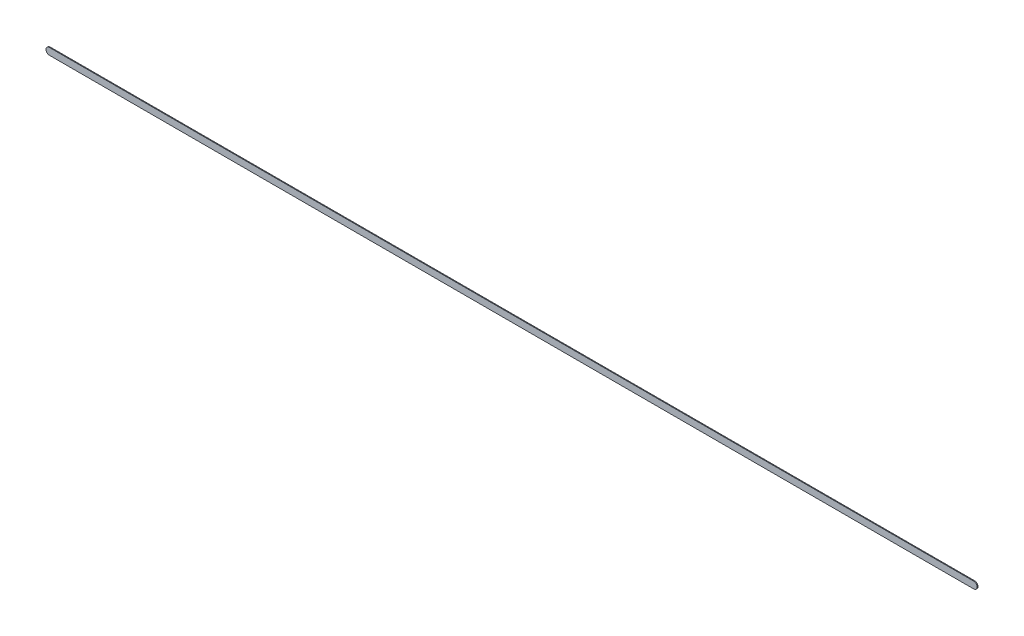
ISO-10303-21;
HEADER;
FILE_DESCRIPTION(('STEP AP214'),'2;1');
FILE_NAME('part.step','',(''),(''),'','','');
FILE_SCHEMA(('AUTOMOTIVE_DESIGN { 1 0 10303 214 1 1 1 1 }'));
ENDSEC;
DATA;
#1=APPLICATION_CONTEXT('core data for automotive mechanical design processes');
#2=APPLICATION_PROTOCOL_DEFINITION('international standard','automotive_design',2000,#1);
#3=PRODUCT_CONTEXT('',#1,'mechanical');
#4=PRODUCT('Part','Part','',(#3));
#5=PRODUCT_RELATED_PRODUCT_CATEGORY('part','',(#4));
#6=PRODUCT_DEFINITION_FORMATION('','',#4);
#7=PRODUCT_DEFINITION_CONTEXT('part definition',#1,'design');
#8=PRODUCT_DEFINITION('design','',#6,#7);
#9=PRODUCT_DEFINITION_SHAPE('','',#8);
#10=(LENGTH_UNIT() NAMED_UNIT(*) SI_UNIT(.MILLI.,.METRE.));
#11=(NAMED_UNIT(*) PLANE_ANGLE_UNIT() SI_UNIT($,.RADIAN.));
#12=(NAMED_UNIT(*) SI_UNIT($,.STERADIAN.) SOLID_ANGLE_UNIT());
#13=UNCERTAINTY_MEASURE_WITH_UNIT(LENGTH_MEASURE(1.E-05),#10,'distance_accuracy_value','');
#14=(GEOMETRIC_REPRESENTATION_CONTEXT(3) GLOBAL_UNCERTAINTY_ASSIGNED_CONTEXT((#13)) GLOBAL_UNIT_ASSIGNED_CONTEXT((#10,
#11,#12)) REPRESENTATION_CONTEXT('',''));
#15=CARTESIAN_POINT('',(0.,0.,0.));
#16=DIRECTION('',(0.,0.,1.));
#17=DIRECTION('',(1.,0.,0.));
#18=AXIS2_PLACEMENT_3D('',#15,#16,#17);
#19=CARTESIAN_POINT('',(118.7,-91.2,1.635));
#20=DIRECTION('',(0.,0.,1.));
#21=DIRECTION('',(1.,0.,0.));
#22=AXIS2_PLACEMENT_3D('',#19,#20,#21);
#23=PLANE('',#22);
#24=DIRECTION('',(-1.,0.,0.));
#25=VECTOR('',#24,1.);
#26=CARTESIAN_POINT('',(118.7,-91.2,1.635));
#27=LINE('',#26,#25);
#28=CARTESIAN_POINT('',(118.7,-91.2,1.635));
#29=VERTEX_POINT('',#28);
#30=CARTESIAN_POINT('',(77.95,-91.2,1.635));
#31=VERTEX_POINT('',#30);
#32=EDGE_CURVE('E80',#29,#31,#27,.T.);
#33=ORIENTED_EDGE('',*,*,#32,.T.);
#34=CARTESIAN_POINT('',(77.95,-91.35,1.635));
#35=DIRECTION('',(0.,0.,1.));
#36=DIRECTION('',(0.,1.,0.));
#37=AXIS2_PLACEMENT_3D('',#34,#35,#36);
#38=CIRCLE('',#37,0.15);
#39=CARTESIAN_POINT('',(77.95,-91.5,1.635));
#40=VERTEX_POINT('',#39);
#41=EDGE_CURVE('E78',#31,#40,#38,.T.);
#42=ORIENTED_EDGE('',*,*,#41,.T.);
#43=DIRECTION('',(1.,0.,0.));
#44=VECTOR('',#43,1.);
#45=CARTESIAN_POINT('',(77.95,-91.5,1.635));
#46=LINE('',#45,#44);
#47=CARTESIAN_POINT('',(118.7,-91.5,1.635));
#48=VERTEX_POINT('',#47);
#49=EDGE_CURVE('E68',#40,#48,#46,.T.);
#50=ORIENTED_EDGE('',*,*,#49,.T.);
#51=CARTESIAN_POINT('',(118.7,-91.35,1.635));
#52=DIRECTION('',(0.,0.,1.));
#53=DIRECTION('',(0.,-1.,0.));
#54=AXIS2_PLACEMENT_3D('',#51,#52,#53);
#55=CIRCLE('',#54,0.15);
#56=EDGE_CURVE('E11',#48,#29,#55,.T.);
#57=ORIENTED_EDGE('',*,*,#56,.T.);
#58=EDGE_LOOP('',(#33,#42,#50,#57));
#59=FACE_BOUND('',#58,.T.);
#60=ADVANCED_FACE('F17',(#59),#23,.T.);
#61=CARTESIAN_POINT('',(118.7,-91.2,1.6));
#62=DIRECTION('',(0.,0.,1.));
#63=DIRECTION('',(1.,0.,0.));
#64=AXIS2_PLACEMENT_3D('',#61,#62,#63);
#65=PLANE('',#64);
#66=CARTESIAN_POINT('',(118.7,-91.35,1.6));
#67=DIRECTION('',(0.,0.,1.));
#68=DIRECTION('',(0.,-1.,0.));
#69=AXIS2_PLACEMENT_3D('',#66,#67,#68);
#70=CIRCLE('',#69,0.15);
#71=CARTESIAN_POINT('',(118.7,-91.5,1.6));
#72=VERTEX_POINT('',#71);
#73=CARTESIAN_POINT('',(118.7,-91.2,1.6));
#74=VERTEX_POINT('',#73);
#75=EDGE_CURVE('E27',#72,#74,#70,.T.);
#76=ORIENTED_EDGE('',*,*,#75,.F.);
#77=DIRECTION('',(1.,0.,0.));
#78=VECTOR('',#77,1.);
#79=CARTESIAN_POINT('',(77.95,-91.5,1.6));
#80=LINE('',#79,#78);
#81=CARTESIAN_POINT('',(77.95,-91.5,1.6));
#82=VERTEX_POINT('',#81);
#83=EDGE_CURVE('E61',#82,#72,#80,.T.);
#84=ORIENTED_EDGE('',*,*,#83,.F.);
#85=CARTESIAN_POINT('',(77.95,-91.35,1.6));
#86=DIRECTION('',(0.,0.,1.));
#87=DIRECTION('',(0.,1.,0.));
#88=AXIS2_PLACEMENT_3D('',#85,#86,#87);
#89=CIRCLE('',#88,0.15);
#90=CARTESIAN_POINT('',(77.95,-91.2,1.6));
#91=VERTEX_POINT('',#90);
#92=EDGE_CURVE('E87',#91,#82,#89,.T.);
#93=ORIENTED_EDGE('',*,*,#92,.F.);
#94=DIRECTION('',(-1.,0.,0.));
#95=VECTOR('',#94,1.);
#96=CARTESIAN_POINT('',(118.7,-91.2,1.6));
#97=LINE('',#96,#95);
#98=EDGE_CURVE('E110',#74,#91,#97,.T.);
#99=ORIENTED_EDGE('',*,*,#98,.F.);
#100=EDGE_LOOP('',(#76,#84,#93,#99));
#101=FACE_BOUND('',#100,.T.);
#102=ADVANCED_FACE('F112',(#101),#65,.F.);
#103=CARTESIAN_POINT('',(118.7,-91.35,1.6));
#104=DIRECTION('',(0.,0.,-1.));
#105=DIRECTION('',(0.,-1.,0.));
#106=AXIS2_PLACEMENT_3D('',#103,#104,#105);
#107=CYLINDRICAL_SURFACE('',#106,0.15);
#108=ORIENTED_EDGE('',*,*,#75,.T.);
#109=DIRECTION('',(0.,0.,1.));
#110=VECTOR('',#109,1.);
#111=CARTESIAN_POINT('',(118.7,-91.2,1.6));
#112=LINE('',#111,#110);
#113=EDGE_CURVE('E94',#74,#29,#112,.T.);
#114=ORIENTED_EDGE('',*,*,#113,.T.);
#115=ORIENTED_EDGE('',*,*,#56,.F.);
#116=DIRECTION('',(0.,0.,1.));
#117=VECTOR('',#116,1.);
#118=CARTESIAN_POINT('',(118.7,-91.5,1.6));
#119=LINE('',#118,#117);
#120=EDGE_CURVE('E20',#72,#48,#119,.T.);
#121=ORIENTED_EDGE('',*,*,#120,.F.);
#122=EDGE_LOOP('',(#108,#114,#115,#121));
#123=FACE_BOUND('',#122,.T.);
#124=ADVANCED_FACE('F104',(#123),#107,.T.);
#125=CARTESIAN_POINT('',(77.95,-91.5,1.6));
#126=DIRECTION('',(0.,1.,0.));
#127=DIRECTION('',(1.,0.,0.));
#128=AXIS2_PLACEMENT_3D('',#125,#126,#127);
#129=PLANE('',#128);
#130=ORIENTED_EDGE('',*,*,#83,.T.);
#131=ORIENTED_EDGE('',*,*,#120,.T.);
#132=ORIENTED_EDGE('',*,*,#49,.F.);
#133=DIRECTION('',(0.,0.,1.));
#134=VECTOR('',#133,1.);
#135=CARTESIAN_POINT('',(77.95,-91.5,1.6));
#136=LINE('',#135,#134);
#137=EDGE_CURVE('E72',#82,#40,#136,.T.);
#138=ORIENTED_EDGE('',*,*,#137,.F.);
#139=EDGE_LOOP('',(#130,#131,#132,#138));
#140=FACE_BOUND('',#139,.T.);
#141=ADVANCED_FACE('F70',(#140),#129,.F.);
#142=CARTESIAN_POINT('',(77.95,-91.35,1.6));
#143=DIRECTION('',(0.,0.,-1.));
#144=DIRECTION('',(0.,1.,0.));
#145=AXIS2_PLACEMENT_3D('',#142,#143,#144);
#146=CYLINDRICAL_SURFACE('',#145,0.15);
#147=ORIENTED_EDGE('',*,*,#92,.T.);
#148=ORIENTED_EDGE('',*,*,#137,.T.);
#149=ORIENTED_EDGE('',*,*,#41,.F.);
#150=DIRECTION('',(0.,0.,1.));
#151=VECTOR('',#150,1.);
#152=CARTESIAN_POINT('',(77.95,-91.2,1.6));
#153=LINE('',#152,#151);
#154=EDGE_CURVE('E114',#91,#31,#153,.T.);
#155=ORIENTED_EDGE('',*,*,#154,.F.);
#156=EDGE_LOOP('',(#147,#148,#149,#155));
#157=FACE_BOUND('',#156,.T.);
#158=ADVANCED_FACE('F86',(#157),#146,.T.);
#159=CARTESIAN_POINT('',(118.7,-91.2,1.6));
#160=DIRECTION('',(0.,-1.,0.));
#161=DIRECTION('',(0.,0.,-1.));
#162=AXIS2_PLACEMENT_3D('',#159,#160,#161);
#163=PLANE('',#162);
#164=ORIENTED_EDGE('',*,*,#98,.T.);
#165=ORIENTED_EDGE('',*,*,#154,.T.);
#166=ORIENTED_EDGE('',*,*,#32,.F.);
#167=ORIENTED_EDGE('',*,*,#113,.F.);
#168=EDGE_LOOP('',(#164,#165,#166,#167));
#169=FACE_BOUND('',#168,.T.);
#170=ADVANCED_FACE('F109',(#169),#163,.F.);
#171=CLOSED_SHELL('',(#60,#102,#124,#141,#158,#170));
#172=MANIFOLD_SOLID_BREP('B1',#171);
#173=ADVANCED_BREP_SHAPE_REPRESENTATION('',(#18,#172),#14);
#174=SHAPE_DEFINITION_REPRESENTATION(#9,#173);
ENDSEC;
END-ISO-10303-21;
